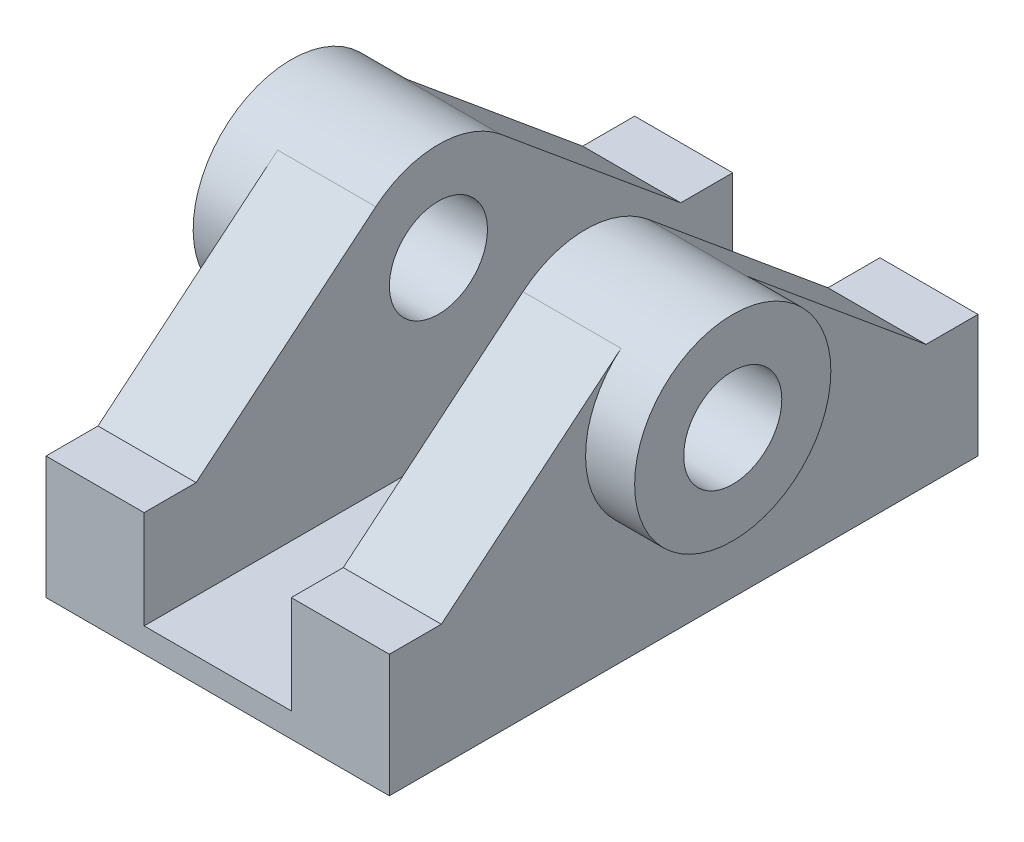
ISO-10303-21;
HEADER;
FILE_DESCRIPTION(('STEP AP214'),'2;1');
FILE_NAME('part.step','',(''),(''),'','','');
FILE_SCHEMA(('AUTOMOTIVE_DESIGN { 1 0 10303 214 1 1 1 1 }'));
ENDSEC;
DATA;
#1=APPLICATION_CONTEXT('core data for automotive mechanical design processes');
#2=APPLICATION_PROTOCOL_DEFINITION('international standard','automotive_design',2000,#1);
#3=PRODUCT_CONTEXT('',#1,'mechanical');
#4=PRODUCT('Part','Part','',(#3));
#5=PRODUCT_RELATED_PRODUCT_CATEGORY('part','',(#4));
#6=PRODUCT_DEFINITION_FORMATION('','',#4);
#7=PRODUCT_DEFINITION_CONTEXT('part definition',#1,'design');
#8=PRODUCT_DEFINITION('design','',#6,#7);
#9=PRODUCT_DEFINITION_SHAPE('','',#8);
#10=(LENGTH_UNIT() NAMED_UNIT(*) SI_UNIT(.MILLI.,.METRE.));
#11=(NAMED_UNIT(*) PLANE_ANGLE_UNIT() SI_UNIT($,.RADIAN.));
#12=(NAMED_UNIT(*) SI_UNIT($,.STERADIAN.) SOLID_ANGLE_UNIT());
#13=UNCERTAINTY_MEASURE_WITH_UNIT(LENGTH_MEASURE(1.E-05),#10,'distance_accuracy_value','');
#14=(GEOMETRIC_REPRESENTATION_CONTEXT(3) GLOBAL_UNCERTAINTY_ASSIGNED_CONTEXT((#13)) GLOBAL_UNIT_ASSIGNED_CONTEXT((#10,
#11,#12)) REPRESENTATION_CONTEXT('',''));
#15=CARTESIAN_POINT('',(0.,0.,0.));
#16=DIRECTION('',(0.,0.,1.));
#17=DIRECTION('',(1.,0.,0.));
#18=AXIS2_PLACEMENT_3D('',#15,#16,#17);
#19=CARTESIAN_POINT('',(0.,25.,0.));
#20=DIRECTION('',(0.,-1.,0.));
#21=DIRECTION('',(0.,0.,-1.));
#22=AXIS2_PLACEMENT_3D('',#19,#20,#21);
#23=PLANE('',#22);
#24=DIRECTION('',(1.,0.,0.));
#25=VECTOR('',#24,1.);
#26=CARTESIAN_POINT('',(15.,25.,-49.403329543192));
#27=LINE('',#26,#25);
#28=CARTESIAN_POINT('',(15.,25.,-49.403329543192));
#29=VERTEX_POINT('',#28);
#30=CARTESIAN_POINT('',(35.,25.,-49.403329543192));
#31=VERTEX_POINT('',#30);
#32=EDGE_CURVE('E64',#29,#31,#27,.T.);
#33=ORIENTED_EDGE('',*,*,#32,.T.);
#34=DIRECTION('',(0.,0.,-1.));
#35=VECTOR('',#34,1.);
#36=CARTESIAN_POINT('',(35.,25.,60.));
#37=LINE('',#36,#35);
#38=CARTESIAN_POINT('',(35.,25.,-60.));
#39=VERTEX_POINT('',#38);
#40=EDGE_CURVE('E258',#31,#39,#37,.T.);
#41=ORIENTED_EDGE('',*,*,#40,.T.);
#42=DIRECTION('',(-1.,0.,0.));
#43=VECTOR('',#42,1.);
#44=CARTESIAN_POINT('',(-35.,25.,-60.));
#45=LINE('',#44,#43);
#46=CARTESIAN_POINT('',(15.,25.,-60.));
#47=VERTEX_POINT('',#46);
#48=EDGE_CURVE('E259',#39,#47,#45,.T.);
#49=ORIENTED_EDGE('',*,*,#48,.T.);
#50=DIRECTION('',(0.,0.,-1.));
#51=VECTOR('',#50,1.);
#52=CARTESIAN_POINT('',(15.,25.,60.));
#53=LINE('',#52,#51);
#54=EDGE_CURVE('E162',#29,#47,#53,.T.);
#55=ORIENTED_EDGE('',*,*,#54,.F.);
#56=EDGE_LOOP('',(#33,#41,#49,#55));
#57=FACE_BOUND('',#56,.T.);
#58=ADVANCED_FACE('F41',(#57),#23,.F.);
#59=CARTESIAN_POINT('',(15.,40.,0.));
#60=DIRECTION('',(1.,0.,0.));
#61=DIRECTION('',(0.,0.,-1.));
#62=AXIS2_PLACEMENT_3D('',#59,#60,#61);
#63=CYLINDRICAL_SURFACE('',#62,20.);
#64=CARTESIAN_POINT('',(45.,40.,0.));
#65=DIRECTION('',(1.,0.,0.));
#66=DIRECTION('',(0.,0.,-1.));
#67=AXIS2_PLACEMENT_3D('',#64,#65,#66);
#68=CIRCLE('',#67,20.);
#69=CARTESIAN_POINT('',(45.,40.,-20.));
#70=VERTEX_POINT('',#69);
#71=EDGE_CURVE('E220',#70,#70,#68,.T.);
#72=ORIENTED_EDGE('',*,*,#71,.F.);
#73=EDGE_LOOP('',(#72));
#74=FACE_BOUND('',#73,.T.);
#75=CARTESIAN_POINT('',(35.,40.,0.));
#76=DIRECTION('',(-1.,0.,0.));
#77=DIRECTION('',(0.,0.,1.));
#78=AXIS2_PLACEMENT_3D('',#75,#76,#77);
#79=CIRCLE('',#78,20.);
#80=CARTESIAN_POINT('',(35.,55.3923555867086,-12.770097473877));
#81=VERTEX_POINT('',#80);
#82=CARTESIAN_POINT('',(35.,55.3923555867086,12.770097473877));
#83=VERTEX_POINT('',#82);
#84=EDGE_CURVE('E154',#81,#83,#79,.T.);
#85=ORIENTED_EDGE('',*,*,#84,.F.);
#86=DIRECTION('',(1.,0.,0.));
#87=VECTOR('',#86,1.);
#88=CARTESIAN_POINT('',(15.,55.3923555867086,-12.770097473877));
#89=LINE('',#88,#87);
#90=CARTESIAN_POINT('',(15.,55.3923555867086,-12.770097473877));
#91=VERTEX_POINT('',#90);
#92=EDGE_CURVE('E198',#91,#81,#89,.T.);
#93=ORIENTED_EDGE('',*,*,#92,.F.);
#94=CARTESIAN_POINT('',(15.,40.,0.));
#95=DIRECTION('',(1.,0.,0.));
#96=DIRECTION('',(0.,0.,-1.));
#97=AXIS2_PLACEMENT_3D('',#94,#95,#96);
#98=CIRCLE('',#97,20.);
#99=CARTESIAN_POINT('',(15.,55.3923555867086,12.770097473877));
#100=VERTEX_POINT('',#99);
#101=EDGE_CURVE('E163',#91,#100,#98,.T.);
#102=ORIENTED_EDGE('',*,*,#101,.T.);
#103=DIRECTION('',(1.,0.,0.));
#104=VECTOR('',#103,1.);
#105=CARTESIAN_POINT('',(15.,55.3923555867086,12.770097473877));
#106=LINE('',#105,#104);
#107=EDGE_CURVE('E166',#100,#83,#106,.T.);
#108=ORIENTED_EDGE('',*,*,#107,.T.);
#109=EDGE_LOOP('',(#85,#93,#102,#108));
#110=FACE_BOUND('',#109,.T.);
#111=ADVANCED_FACE('F167',(#74,#110),#63,.T.);
#112=DIRECTION('',(-1.,0.,0.));
#113=VECTOR('',#112,1.);
#114=CARTESIAN_POINT('',(-15.,25.,49.403329543192));
#115=LINE('',#114,#113);
#116=CARTESIAN_POINT('',(-15.,25.,49.403329543192));
#117=VERTEX_POINT('',#116);
#118=CARTESIAN_POINT('',(-35.,25.,49.403329543192));
#119=VERTEX_POINT('',#118);
#120=EDGE_CURVE('E195',#117,#119,#115,.T.);
#121=ORIENTED_EDGE('',*,*,#120,.T.);
#122=DIRECTION('',(0.,0.,1.));
#123=VECTOR('',#122,1.);
#124=CARTESIAN_POINT('',(-35.,25.,60.));
#125=LINE('',#124,#123);
#126=CARTESIAN_POINT('',(-35.,25.,60.));
#127=VERTEX_POINT('',#126);
#128=EDGE_CURVE('E262',#119,#127,#125,.T.);
#129=ORIENTED_EDGE('',*,*,#128,.T.);
#130=DIRECTION('',(1.,0.,0.));
#131=VECTOR('',#130,1.);
#132=CARTESIAN_POINT('',(-35.,25.,60.));
#133=LINE('',#132,#131);
#134=CARTESIAN_POINT('',(-15.,25.,60.));
#135=VERTEX_POINT('',#134);
#136=EDGE_CURVE('E267',#127,#135,#133,.T.);
#137=ORIENTED_EDGE('',*,*,#136,.T.);
#138=DIRECTION('',(0.,0.,1.));
#139=VECTOR('',#138,1.);
#140=CARTESIAN_POINT('',(-15.,25.,60.));
#141=LINE('',#140,#139);
#142=EDGE_CURVE('E243',#117,#135,#141,.T.);
#143=ORIENTED_EDGE('',*,*,#142,.F.);
#144=EDGE_LOOP('',(#121,#129,#137,#143));
#145=FACE_BOUND('',#144,.T.);
#146=ADVANCED_FACE('F326',(#145),#23,.F.);
#147=CARTESIAN_POINT('',(-15.,40.,0.));
#148=DIRECTION('',(-1.,0.,0.));
#149=DIRECTION('',(0.,0.,1.));
#150=AXIS2_PLACEMENT_3D('',#147,#148,#149);
#151=CYLINDRICAL_SURFACE('',#150,20.);
#152=CARTESIAN_POINT('',(-45.,40.,0.));
#153=DIRECTION('',(1.,0.,0.));
#154=DIRECTION('',(0.,0.,-1.));
#155=AXIS2_PLACEMENT_3D('',#152,#153,#154);
#156=CIRCLE('',#155,20.);
#157=CARTESIAN_POINT('',(-45.,40.,-20.));
#158=VERTEX_POINT('',#157);
#159=EDGE_CURVE('E206',#158,#158,#156,.T.);
#160=ORIENTED_EDGE('',*,*,#159,.T.);
#161=EDGE_LOOP('',(#160));
#162=FACE_BOUND('',#161,.T.);
#163=CARTESIAN_POINT('',(-15.,40.,0.));
#164=DIRECTION('',(1.,0.,0.));
#165=DIRECTION('',(0.,0.,-1.));
#166=AXIS2_PLACEMENT_3D('',#163,#164,#165);
#167=CIRCLE('',#166,20.);
#168=CARTESIAN_POINT('',(-15.,55.3923555867086,-12.770097473877));
#169=VERTEX_POINT('',#168);
#170=CARTESIAN_POINT('',(-15.,55.3923555867086,12.770097473877));
#171=VERTEX_POINT('',#170);
#172=EDGE_CURVE('E209',#169,#171,#167,.T.);
#173=ORIENTED_EDGE('',*,*,#172,.F.);
#174=DIRECTION('',(-1.,0.,0.));
#175=VECTOR('',#174,1.);
#176=CARTESIAN_POINT('',(-15.,55.3923555867086,-12.770097473877));
#177=LINE('',#176,#175);
#178=CARTESIAN_POINT('',(-35.,55.3923555867086,-12.770097473877));
#179=VERTEX_POINT('',#178);
#180=EDGE_CURVE('E183',#169,#179,#177,.T.);
#181=ORIENTED_EDGE('',*,*,#180,.T.);
#182=CARTESIAN_POINT('',(-35.,40.,0.));
#183=DIRECTION('',(1.,0.,0.));
#184=DIRECTION('',(0.,0.,-1.));
#185=AXIS2_PLACEMENT_3D('',#182,#183,#184);
#186=CIRCLE('',#185,20.);
#187=CARTESIAN_POINT('',(-35.,55.3923555867086,12.770097473877));
#188=VERTEX_POINT('',#187);
#189=EDGE_CURVE('E212',#179,#188,#186,.F.);
#190=ORIENTED_EDGE('',*,*,#189,.T.);
#191=DIRECTION('',(-1.,0.,0.));
#192=VECTOR('',#191,1.);
#193=CARTESIAN_POINT('',(-15.,55.3923555867086,12.770097473877));
#194=LINE('',#193,#192);
#195=EDGE_CURVE('E187',#171,#188,#194,.T.);
#196=ORIENTED_EDGE('',*,*,#195,.F.);
#197=EDGE_LOOP('',(#173,#181,#190,#196));
#198=FACE_BOUND('',#197,.T.);
#199=ADVANCED_FACE('F337',(#162,#198),#151,.T.);
#200=CARTESIAN_POINT('',(-35.,25.,-60.));
#201=VERTEX_POINT('',#200);
#202=CARTESIAN_POINT('',(-35.,25.,-49.403329543192));
#203=VERTEX_POINT('',#202);
#204=EDGE_CURVE('E263',#201,#203,#125,.T.);
#205=ORIENTED_EDGE('',*,*,#204,.T.);
#206=DIRECTION('',(-1.,0.,0.));
#207=VECTOR('',#206,1.);
#208=CARTESIAN_POINT('',(-15.,25.,-49.403329543192));
#209=LINE('',#208,#207);
#210=CARTESIAN_POINT('',(-15.,25.,-49.403329543192));
#211=VERTEX_POINT('',#210);
#212=EDGE_CURVE('E188',#211,#203,#209,.T.);
#213=ORIENTED_EDGE('',*,*,#212,.F.);
#214=CARTESIAN_POINT('',(-15.,25.,-60.));
#215=VERTEX_POINT('',#214);
#216=EDGE_CURVE('E230',#215,#211,#141,.T.);
#217=ORIENTED_EDGE('',*,*,#216,.F.);
#218=EDGE_CURVE('E257',#215,#201,#45,.T.);
#219=ORIENTED_EDGE('',*,*,#218,.T.);
#220=EDGE_LOOP('',(#205,#213,#217,#219));
#221=FACE_BOUND('',#220,.T.);
#222=ADVANCED_FACE('F325',(#221),#23,.F.);
#223=CARTESIAN_POINT('',(35.,25.,60.));
#224=VERTEX_POINT('',#223);
#225=CARTESIAN_POINT('',(35.,25.,49.403329543192));
#226=VERTEX_POINT('',#225);
#227=EDGE_CURVE('E56',#224,#226,#37,.T.);
#228=ORIENTED_EDGE('',*,*,#227,.T.);
#229=DIRECTION('',(1.,0.,0.));
#230=VECTOR('',#229,1.);
#231=CARTESIAN_POINT('',(15.,25.,49.403329543192));
#232=LINE('',#231,#230);
#233=CARTESIAN_POINT('',(15.,25.,49.403329543192));
#234=VERTEX_POINT('',#233);
#235=EDGE_CURVE('E172',#234,#226,#232,.T.);
#236=ORIENTED_EDGE('',*,*,#235,.F.);
#237=CARTESIAN_POINT('',(15.,25.,60.));
#238=VERTEX_POINT('',#237);
#239=EDGE_CURVE('E240',#238,#234,#53,.T.);
#240=ORIENTED_EDGE('',*,*,#239,.F.);
#241=EDGE_CURVE('E266',#238,#224,#133,.T.);
#242=ORIENTED_EDGE('',*,*,#241,.T.);
#243=EDGE_LOOP('',(#228,#236,#240,#242));
#244=FACE_BOUND('',#243,.T.);
#245=ADVANCED_FACE('F336',(#244),#23,.F.);
#246=CARTESIAN_POINT('',(35.,25.,60.));
#247=DIRECTION('',(-1.,0.,0.));
#248=DIRECTION('',(0.,0.,1.));
#249=AXIS2_PLACEMENT_3D('',#246,#247,#248);
#250=PLANE('',#249);
#251=ORIENTED_EDGE('',*,*,#40,.F.);
#252=DIRECTION('',(0.,-0.63850487369385,-0.769617779335432));
#253=VECTOR('',#252,1.);
#254=CARTESIAN_POINT('',(35.,39.0848166374767,-32.4262855933614));
#255=LINE('',#254,#253);
#256=EDGE_CURVE('E159',#81,#31,#255,.T.);
#257=ORIENTED_EDGE('',*,*,#256,.F.);
#258=ORIENTED_EDGE('',*,*,#84,.T.);
#259=DIRECTION('',(0.,-0.63850487369385,0.769617779335432));
#260=VECTOR('',#259,1.);
#261=CARTESIAN_POINT('',(35.,39.0848166374767,32.4262855933614));
#262=LINE('',#261,#260);
#263=EDGE_CURVE('E157',#83,#226,#262,.T.);
#264=ORIENTED_EDGE('',*,*,#263,.T.);
#265=ORIENTED_EDGE('',*,*,#227,.F.);
#266=DIRECTION('',(0.,-1.,0.));
#267=VECTOR('',#266,1.);
#268=CARTESIAN_POINT('',(35.,25.,60.));
#269=LINE('',#268,#267);
#270=CARTESIAN_POINT('',(35.,0.,60.));
#271=VERTEX_POINT('',#270);
#272=EDGE_CURVE('E270',#224,#271,#269,.T.);
#273=ORIENTED_EDGE('',*,*,#272,.T.);
#274=DIRECTION('',(0.,0.,-1.));
#275=VECTOR('',#274,1.);
#276=CARTESIAN_POINT('',(35.,0.,60.));
#277=LINE('',#276,#275);
#278=CARTESIAN_POINT('',(35.,0.,-60.));
#279=VERTEX_POINT('',#278);
#280=EDGE_CURVE('E248',#271,#279,#277,.T.);
#281=ORIENTED_EDGE('',*,*,#280,.T.);
#282=DIRECTION('',(0.,-1.,0.));
#283=VECTOR('',#282,1.);
#284=CARTESIAN_POINT('',(35.,25.,-60.));
#285=LINE('',#284,#283);
#286=EDGE_CURVE('E11',#39,#279,#285,.T.);
#287=ORIENTED_EDGE('',*,*,#286,.F.);
#288=EDGE_LOOP('',(#251,#257,#258,#264,#265,#273,#281,#287));
#289=FACE_BOUND('',#288,.T.);
#290=ADVANCED_FACE('F43',(#289),#250,.F.);
#291=CARTESIAN_POINT('',(-35.,25.,-60.));
#292=DIRECTION('',(0.,0.,1.));
#293=DIRECTION('',(1.,0.,0.));
#294=AXIS2_PLACEMENT_3D('',#291,#292,#293);
#295=PLANE('',#294);
#296=DIRECTION('',(-1.,0.,0.));
#297=VECTOR('',#296,1.);
#298=CARTESIAN_POINT('',(-15.,5.,-60.));
#299=LINE('',#298,#297);
#300=CARTESIAN_POINT('',(15.,5.,-60.));
#301=VERTEX_POINT('',#300);
#302=CARTESIAN_POINT('',(-15.,5.,-60.));
#303=VERTEX_POINT('',#302);
#304=EDGE_CURVE('E229',#301,#303,#299,.T.);
#305=ORIENTED_EDGE('',*,*,#304,.F.);
#306=DIRECTION('',(0.,1.,0.));
#307=VECTOR('',#306,1.);
#308=CARTESIAN_POINT('',(15.,5.,-60.));
#309=LINE('',#308,#307);
#310=EDGE_CURVE('E239',#301,#47,#309,.T.);
#311=ORIENTED_EDGE('',*,*,#310,.T.);
#312=ORIENTED_EDGE('',*,*,#48,.F.);
#313=ORIENTED_EDGE('',*,*,#286,.T.);
#314=DIRECTION('',(-1.,0.,0.));
#315=VECTOR('',#314,1.);
#316=CARTESIAN_POINT('',(-35.,0.,-60.));
#317=LINE('',#316,#315);
#318=CARTESIAN_POINT('',(-35.,0.,-60.));
#319=VERTEX_POINT('',#318);
#320=EDGE_CURVE('E273',#279,#319,#317,.T.);
#321=ORIENTED_EDGE('',*,*,#320,.T.);
#322=DIRECTION('',(0.,-1.,0.));
#323=VECTOR('',#322,1.);
#324=CARTESIAN_POINT('',(-35.,25.,-60.));
#325=LINE('',#324,#323);
#326=EDGE_CURVE('E49',#201,#319,#325,.T.);
#327=ORIENTED_EDGE('',*,*,#326,.F.);
#328=ORIENTED_EDGE('',*,*,#218,.F.);
#329=DIRECTION('',(0.,1.,0.));
#330=VECTOR('',#329,1.);
#331=CARTESIAN_POINT('',(-15.,5.,-60.));
#332=LINE('',#331,#330);
#333=EDGE_CURVE('E252',#303,#215,#332,.T.);
#334=ORIENTED_EDGE('',*,*,#333,.F.);
#335=EDGE_LOOP('',(#305,#311,#312,#313,#321,#327,#328,#334));
#336=FACE_BOUND('',#335,.T.);
#337=ADVANCED_FACE('F304',(#336),#295,.F.);
#338=CARTESIAN_POINT('',(-35.,25.,60.));
#339=DIRECTION('',(1.,0.,0.));
#340=DIRECTION('',(0.,0.,-1.));
#341=AXIS2_PLACEMENT_3D('',#338,#339,#340);
#342=PLANE('',#341);
#343=ORIENTED_EDGE('',*,*,#189,.F.);
#344=DIRECTION('',(0.,-0.63850487369385,-0.769617779335432));
#345=VECTOR('',#344,1.);
#346=CARTESIAN_POINT('',(-35.,39.0848166374767,-32.4262855933614));
#347=LINE('',#346,#345);
#348=EDGE_CURVE('E184',#179,#203,#347,.T.);
#349=ORIENTED_EDGE('',*,*,#348,.T.);
#350=ORIENTED_EDGE('',*,*,#204,.F.);
#351=ORIENTED_EDGE('',*,*,#326,.T.);
#352=DIRECTION('',(0.,0.,1.));
#353=VECTOR('',#352,1.);
#354=CARTESIAN_POINT('',(-35.,0.,60.));
#355=LINE('',#354,#353);
#356=CARTESIAN_POINT('',(-35.,0.,60.));
#357=VERTEX_POINT('',#356);
#358=EDGE_CURVE('E275',#319,#357,#355,.T.);
#359=ORIENTED_EDGE('',*,*,#358,.T.);
#360=DIRECTION('',(0.,-1.,0.));
#361=VECTOR('',#360,1.);
#362=CARTESIAN_POINT('',(-35.,25.,60.));
#363=LINE('',#362,#361);
#364=EDGE_CURVE('E281',#127,#357,#363,.T.);
#365=ORIENTED_EDGE('',*,*,#364,.F.);
#366=ORIENTED_EDGE('',*,*,#128,.F.);
#367=DIRECTION('',(0.,-0.63850487369385,0.769617779335432));
#368=VECTOR('',#367,1.);
#369=CARTESIAN_POINT('',(-35.,39.0848166374767,32.4262855933614));
#370=LINE('',#369,#368);
#371=EDGE_CURVE('E196',#188,#119,#370,.T.);
#372=ORIENTED_EDGE('',*,*,#371,.F.);
#373=EDGE_LOOP('',(#343,#349,#350,#351,#359,#365,#366,#372));
#374=FACE_BOUND('',#373,.T.);
#375=ADVANCED_FACE('F288',(#374),#342,.F.);
#376=CARTESIAN_POINT('',(-35.,25.,60.));
#377=DIRECTION('',(0.,0.,-1.));
#378=DIRECTION('',(-1.,0.,0.));
#379=AXIS2_PLACEMENT_3D('',#376,#377,#378);
#380=PLANE('',#379);
#381=ORIENTED_EDGE('',*,*,#241,.F.);
#382=DIRECTION('',(0.,1.,0.));
#383=VECTOR('',#382,1.);
#384=CARTESIAN_POINT('',(15.,5.,60.));
#385=LINE('',#384,#383);
#386=CARTESIAN_POINT('',(15.,5.,60.));
#387=VERTEX_POINT('',#386);
#388=EDGE_CURVE('E246',#387,#238,#385,.T.);
#389=ORIENTED_EDGE('',*,*,#388,.F.);
#390=DIRECTION('',(1.,0.,0.));
#391=VECTOR('',#390,1.);
#392=CARTESIAN_POINT('',(-15.,5.,60.));
#393=LINE('',#392,#391);
#394=CARTESIAN_POINT('',(-15.,5.,60.));
#395=VERTEX_POINT('',#394);
#396=EDGE_CURVE('E236',#395,#387,#393,.T.);
#397=ORIENTED_EDGE('',*,*,#396,.F.);
#398=DIRECTION('',(0.,1.,0.));
#399=VECTOR('',#398,1.);
#400=CARTESIAN_POINT('',(-15.,5.,60.));
#401=LINE('',#400,#399);
#402=EDGE_CURVE('E249',#395,#135,#401,.T.);
#403=ORIENTED_EDGE('',*,*,#402,.T.);
#404=ORIENTED_EDGE('',*,*,#136,.F.);
#405=ORIENTED_EDGE('',*,*,#364,.T.);
#406=DIRECTION('',(1.,0.,0.));
#407=VECTOR('',#406,1.);
#408=CARTESIAN_POINT('',(-35.,0.,60.));
#409=LINE('',#408,#407);
#410=EDGE_CURVE('E277',#357,#271,#409,.T.);
#411=ORIENTED_EDGE('',*,*,#410,.T.);
#412=ORIENTED_EDGE('',*,*,#272,.F.);
#413=EDGE_LOOP('',(#381,#389,#397,#403,#404,#405,#411,#412));
#414=FACE_BOUND('',#413,.T.);
#415=ADVANCED_FACE('F299',(#414),#380,.F.);
#416=CARTESIAN_POINT('',(0.,0.,0.));
#417=DIRECTION('',(0.,-1.,0.));
#418=DIRECTION('',(0.,0.,-1.));
#419=AXIS2_PLACEMENT_3D('',#416,#417,#418);
#420=PLANE('',#419);
#421=ORIENTED_EDGE('',*,*,#280,.F.);
#422=ORIENTED_EDGE('',*,*,#410,.F.);
#423=ORIENTED_EDGE('',*,*,#358,.F.);
#424=ORIENTED_EDGE('',*,*,#320,.F.);
#425=EDGE_LOOP('',(#421,#422,#423,#424));
#426=FACE_BOUND('',#425,.T.);
#427=ADVANCED_FACE('F295',(#426),#420,.T.);
#428=CARTESIAN_POINT('',(15.,5.,60.));
#429=DIRECTION('',(1.,0.,0.));
#430=DIRECTION('',(0.,0.,-1.));
#431=AXIS2_PLACEMENT_3D('',#428,#429,#430);
#432=PLANE('',#431);
#433=DIRECTION('',(0.,-0.63850487369385,-0.769617779335432));
#434=VECTOR('',#433,1.);
#435=CARTESIAN_POINT('',(15.,39.0848166374767,-32.4262855933614));
#436=LINE('',#435,#434);
#437=EDGE_CURVE('E308',#91,#29,#436,.T.);
#438=ORIENTED_EDGE('',*,*,#437,.T.);
#439=ORIENTED_EDGE('',*,*,#54,.T.);
#440=ORIENTED_EDGE('',*,*,#310,.F.);
#441=DIRECTION('',(0.,0.,-1.));
#442=VECTOR('',#441,1.);
#443=CARTESIAN_POINT('',(15.,5.,60.));
#444=LINE('',#443,#442);
#445=EDGE_CURVE('E226',#387,#301,#444,.T.);
#446=ORIENTED_EDGE('',*,*,#445,.F.);
#447=ORIENTED_EDGE('',*,*,#388,.T.);
#448=ORIENTED_EDGE('',*,*,#239,.T.);
#449=DIRECTION('',(0.,-0.63850487369385,0.769617779335432));
#450=VECTOR('',#449,1.);
#451=CARTESIAN_POINT('',(15.,39.0848166374767,32.4262855933614));
#452=LINE('',#451,#450);
#453=EDGE_CURVE('E173',#100,#234,#452,.T.);
#454=ORIENTED_EDGE('',*,*,#453,.F.);
#455=ORIENTED_EDGE('',*,*,#101,.F.);
#456=EDGE_LOOP('',(#438,#439,#440,#446,#447,#448,#454,#455));
#457=FACE_BOUND('',#456,.T.);
#458=CARTESIAN_POINT('',(15.,40.,0.));
#459=DIRECTION('',(1.,0.,0.));
#460=DIRECTION('',(0.,0.,-1.));
#461=AXIS2_PLACEMENT_3D('',#458,#459,#460);
#462=CIRCLE('',#461,10.);
#463=CARTESIAN_POINT('',(15.,40.,-10.));
#464=VERTEX_POINT('',#463);
#465=EDGE_CURVE('E217',#464,#464,#462,.T.);
#466=ORIENTED_EDGE('',*,*,#465,.T.);
#467=EDGE_LOOP('',(#466));
#468=FACE_BOUND('',#467,.T.);
#469=ADVANCED_FACE('F309',(#457,#468),#432,.F.);
#470=CARTESIAN_POINT('',(-15.,5.,60.));
#471=DIRECTION('',(-1.,0.,0.));
#472=DIRECTION('',(0.,0.,1.));
#473=AXIS2_PLACEMENT_3D('',#470,#471,#472);
#474=PLANE('',#473);
#475=ORIENTED_EDGE('',*,*,#216,.T.);
#476=DIRECTION('',(0.,-0.63850487369385,-0.769617779335432));
#477=VECTOR('',#476,1.);
#478=CARTESIAN_POINT('',(-15.,39.0848166374767,-32.4262855933614));
#479=LINE('',#478,#477);
#480=EDGE_CURVE('E181',#169,#211,#479,.T.);
#481=ORIENTED_EDGE('',*,*,#480,.F.);
#482=ORIENTED_EDGE('',*,*,#172,.T.);
#483=DIRECTION('',(0.,-0.63850487369385,0.769617779335432));
#484=VECTOR('',#483,1.);
#485=CARTESIAN_POINT('',(-15.,39.0848166374767,32.4262855933614));
#486=LINE('',#485,#484);
#487=EDGE_CURVE('E193',#171,#117,#486,.T.);
#488=ORIENTED_EDGE('',*,*,#487,.T.);
#489=ORIENTED_EDGE('',*,*,#142,.T.);
#490=ORIENTED_EDGE('',*,*,#402,.F.);
#491=DIRECTION('',(0.,0.,1.));
#492=VECTOR('',#491,1.);
#493=CARTESIAN_POINT('',(-15.,5.,60.));
#494=LINE('',#493,#492);
#495=EDGE_CURVE('E233',#303,#395,#494,.T.);
#496=ORIENTED_EDGE('',*,*,#495,.F.);
#497=ORIENTED_EDGE('',*,*,#333,.T.);
#498=EDGE_LOOP('',(#475,#481,#482,#488,#489,#490,#496,#497));
#499=FACE_BOUND('',#498,.T.);
#500=CARTESIAN_POINT('',(-15.,40.,0.));
#501=DIRECTION('',(1.,0.,0.));
#502=DIRECTION('',(0.,0.,-1.));
#503=AXIS2_PLACEMENT_3D('',#500,#501,#502);
#504=CIRCLE('',#503,10.);
#505=CARTESIAN_POINT('',(-15.,40.,-10.));
#506=VERTEX_POINT('',#505);
#507=EDGE_CURVE('E203',#506,#506,#504,.T.);
#508=ORIENTED_EDGE('',*,*,#507,.F.);
#509=EDGE_LOOP('',(#508));
#510=FACE_BOUND('',#509,.T.);
#511=ADVANCED_FACE('F364',(#499,#510),#474,.F.);
#512=CARTESIAN_POINT('',(0.,5.,0.));
#513=DIRECTION('',(0.,-1.,0.));
#514=DIRECTION('',(0.,0.,-1.));
#515=AXIS2_PLACEMENT_3D('',#512,#513,#514);
#516=PLANE('',#515);
#517=ORIENTED_EDGE('',*,*,#445,.T.);
#518=ORIENTED_EDGE('',*,*,#304,.T.);
#519=ORIENTED_EDGE('',*,*,#495,.T.);
#520=ORIENTED_EDGE('',*,*,#396,.T.);
#521=EDGE_LOOP('',(#517,#518,#519,#520));
#522=FACE_BOUND('',#521,.T.);
#523=ADVANCED_FACE('F368',(#522),#516,.F.);
#524=CARTESIAN_POINT('',(45.,40.,0.));
#525=DIRECTION('',(1.,0.,0.));
#526=DIRECTION('',(0.,0.,-1.));
#527=AXIS2_PLACEMENT_3D('',#524,#525,#526);
#528=PLANE('',#527);
#529=CARTESIAN_POINT('',(45.,40.,0.));
#530=DIRECTION('',(1.,0.,0.));
#531=DIRECTION('',(0.,0.,-1.));
#532=AXIS2_PLACEMENT_3D('',#529,#530,#531);
#533=CIRCLE('',#532,10.);
#534=CARTESIAN_POINT('',(45.,40.,-10.));
#535=VERTEX_POINT('',#534);
#536=EDGE_CURVE('E216',#535,#535,#533,.T.);
#537=ORIENTED_EDGE('',*,*,#536,.F.);
#538=EDGE_LOOP('',(#537));
#539=FACE_BOUND('',#538,.T.);
#540=ORIENTED_EDGE('',*,*,#71,.T.);
#541=EDGE_LOOP('',(#540));
#542=FACE_BOUND('',#541,.T.);
#543=ADVANCED_FACE('F373',(#539,#542),#528,.T.);
#544=CARTESIAN_POINT('',(15.,40.,0.));
#545=DIRECTION('',(1.,0.,0.));
#546=DIRECTION('',(0.,0.,-1.));
#547=AXIS2_PLACEMENT_3D('',#544,#545,#546);
#548=CYLINDRICAL_SURFACE('',#547,10.);
#549=ORIENTED_EDGE('',*,*,#465,.F.);
#550=EDGE_LOOP('',(#549));
#551=FACE_BOUND('',#550,.T.);
#552=ORIENTED_EDGE('',*,*,#536,.T.);
#553=EDGE_LOOP('',(#552));
#554=FACE_BOUND('',#553,.T.);
#555=ADVANCED_FACE('F378',(#551,#554),#548,.F.);
#556=CARTESIAN_POINT('',(-45.,40.,0.));
#557=DIRECTION('',(-1.,0.,0.));
#558=DIRECTION('',(0.,0.,-1.));
#559=AXIS2_PLACEMENT_3D('',#556,#557,#558);
#560=PLANE('',#559);
#561=ORIENTED_EDGE('',*,*,#159,.F.);
#562=EDGE_LOOP('',(#561));
#563=FACE_BOUND('',#562,.T.);
#564=CARTESIAN_POINT('',(-45.,40.,0.));
#565=DIRECTION('',(1.,0.,0.));
#566=DIRECTION('',(0.,0.,-1.));
#567=AXIS2_PLACEMENT_3D('',#564,#565,#566);
#568=CIRCLE('',#567,10.);
#569=CARTESIAN_POINT('',(-45.,40.,-10.));
#570=VERTEX_POINT('',#569);
#571=EDGE_CURVE('E190',#570,#570,#568,.T.);
#572=ORIENTED_EDGE('',*,*,#571,.T.);
#573=EDGE_LOOP('',(#572));
#574=FACE_BOUND('',#573,.T.);
#575=ADVANCED_FACE('F381',(#563,#574),#560,.T.);
#576=CARTESIAN_POINT('',(-15.,40.,0.));
#577=DIRECTION('',(-1.,0.,0.));
#578=DIRECTION('',(0.,0.,1.));
#579=AXIS2_PLACEMENT_3D('',#576,#577,#578);
#580=CYLINDRICAL_SURFACE('',#579,10.);
#581=ORIENTED_EDGE('',*,*,#507,.T.);
#582=EDGE_LOOP('',(#581));
#583=FACE_BOUND('',#582,.T.);
#584=ORIENTED_EDGE('',*,*,#571,.F.);
#585=EDGE_LOOP('',(#584));
#586=FACE_BOUND('',#585,.T.);
#587=ADVANCED_FACE('F386',(#583,#586),#580,.F.);
#588=CARTESIAN_POINT('',(-15.,39.0848166374767,32.4262855933614));
#589=DIRECTION('',(0.,-0.769617779335431,-0.63850487369385));
#590=DIRECTION('',(0.,0.63850487369385,-0.769617779335431));
#591=AXIS2_PLACEMENT_3D('',#588,#589,#590);
#592=PLANE('',#591);
#593=ORIENTED_EDGE('',*,*,#371,.T.);
#594=ORIENTED_EDGE('',*,*,#120,.F.);
#595=ORIENTED_EDGE('',*,*,#487,.F.);
#596=ORIENTED_EDGE('',*,*,#195,.T.);
#597=EDGE_LOOP('',(#593,#594,#595,#596));
#598=FACE_BOUND('',#597,.T.);
#599=ADVANCED_FACE('F389',(#598),#592,.F.);
#600=CARTESIAN_POINT('',(-15.,39.0848166374767,-32.4262855933614));
#601=DIRECTION('',(0.,0.769617779335431,-0.63850487369385));
#602=DIRECTION('',(0.,0.63850487369385,0.769617779335431));
#603=AXIS2_PLACEMENT_3D('',#600,#601,#602);
#604=PLANE('',#603);
#605=ORIENTED_EDGE('',*,*,#348,.F.);
#606=ORIENTED_EDGE('',*,*,#180,.F.);
#607=ORIENTED_EDGE('',*,*,#480,.T.);
#608=ORIENTED_EDGE('',*,*,#212,.T.);
#609=EDGE_LOOP('',(#605,#606,#607,#608));
#610=FACE_BOUND('',#609,.T.);
#611=ADVANCED_FACE('F321',(#610),#604,.T.);
#612=CARTESIAN_POINT('',(15.,39.0848166374767,32.4262855933614));
#613=DIRECTION('',(0.,0.769617779335431,0.63850487369385));
#614=DIRECTION('',(0.,-0.63850487369385,0.769617779335431));
#615=AXIS2_PLACEMENT_3D('',#612,#613,#614);
#616=PLANE('',#615);
#617=ORIENTED_EDGE('',*,*,#263,.F.);
#618=ORIENTED_EDGE('',*,*,#107,.F.);
#619=ORIENTED_EDGE('',*,*,#453,.T.);
#620=ORIENTED_EDGE('',*,*,#235,.T.);
#621=EDGE_LOOP('',(#617,#618,#619,#620));
#622=FACE_BOUND('',#621,.T.);
#623=ADVANCED_FACE('F175',(#622),#616,.T.);
#624=CARTESIAN_POINT('',(15.,39.0848166374767,-32.4262855933614));
#625=DIRECTION('',(0.,-0.769617779335431,0.63850487369385));
#626=DIRECTION('',(0.,-0.63850487369385,-0.769617779335431));
#627=AXIS2_PLACEMENT_3D('',#624,#625,#626);
#628=PLANE('',#627);
#629=ORIENTED_EDGE('',*,*,#256,.T.);
#630=ORIENTED_EDGE('',*,*,#32,.F.);
#631=ORIENTED_EDGE('',*,*,#437,.F.);
#632=ORIENTED_EDGE('',*,*,#92,.T.);
#633=EDGE_LOOP('',(#629,#630,#631,#632));
#634=FACE_BOUND('',#633,.T.);
#635=ADVANCED_FACE('F313',(#634),#628,.F.);
#636=CLOSED_SHELL('',(#58,#111,#146,#199,#222,#245,#290,#337,#375,#415,#427,#469,#511,#523,#543,
#555,#575,#587,#599,#611,#623,#635));
#637=MANIFOLD_SOLID_BREP('B2',#636);
#638=ADVANCED_BREP_SHAPE_REPRESENTATION('',(#18,#637),#14);
#639=SHAPE_DEFINITION_REPRESENTATION(#9,#638);
ENDSEC;
END-ISO-10303-21;
